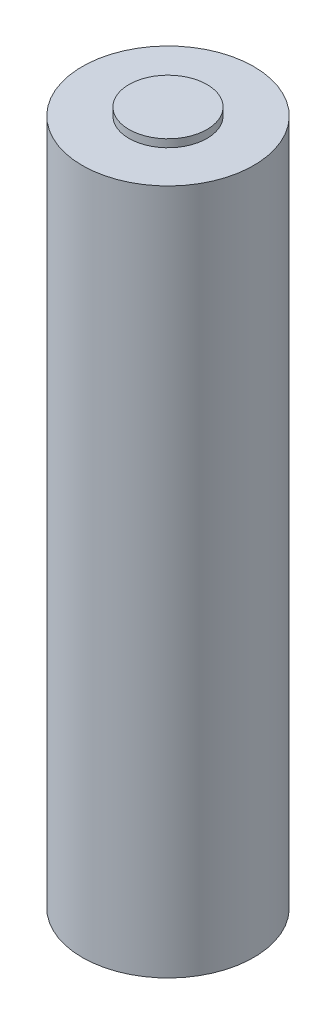
ISO-10303-21;
HEADER;
FILE_DESCRIPTION(('STEP AP214'),'2;1');
FILE_NAME('part.step','',(''),(''),'','','');
FILE_SCHEMA(('AUTOMOTIVE_DESIGN { 1 0 10303 214 1 1 1 1 }'));
ENDSEC;
DATA;
#1=APPLICATION_CONTEXT('core data for automotive mechanical design processes');
#2=APPLICATION_PROTOCOL_DEFINITION('international standard','automotive_design',2000,#1);
#3=PRODUCT_CONTEXT('',#1,'mechanical');
#4=PRODUCT('Part','Part','',(#3));
#5=PRODUCT_RELATED_PRODUCT_CATEGORY('part','',(#4));
#6=PRODUCT_DEFINITION_FORMATION('','',#4);
#7=PRODUCT_DEFINITION_CONTEXT('part definition',#1,'design');
#8=PRODUCT_DEFINITION('design','',#6,#7);
#9=PRODUCT_DEFINITION_SHAPE('','',#8);
#10=(LENGTH_UNIT() NAMED_UNIT(*) SI_UNIT(.MILLI.,.METRE.));
#11=(NAMED_UNIT(*) PLANE_ANGLE_UNIT() SI_UNIT($,.RADIAN.));
#12=(NAMED_UNIT(*) SI_UNIT($,.STERADIAN.) SOLID_ANGLE_UNIT());
#13=UNCERTAINTY_MEASURE_WITH_UNIT(LENGTH_MEASURE(1.E-05),#10,'distance_accuracy_value','');
#14=(GEOMETRIC_REPRESENTATION_CONTEXT(3) GLOBAL_UNCERTAINTY_ASSIGNED_CONTEXT((#13)) GLOBAL_UNIT_ASSIGNED_CONTEXT((#10,
#11,#12)) REPRESENTATION_CONTEXT('',''));
#15=CARTESIAN_POINT('',(0.,0.,0.));
#16=DIRECTION('',(0.,0.,1.));
#17=DIRECTION('',(1.,0.,0.));
#18=AXIS2_PLACEMENT_3D('',#15,#16,#17);
#19=CARTESIAN_POINT('',(0.,44.,0.));
#20=DIRECTION('',(0.,1.,0.));
#21=DIRECTION('',(0.,0.,1.));
#22=AXIS2_PLACEMENT_3D('',#19,#20,#21);
#23=PLANE('',#22);
#24=CARTESIAN_POINT('',(0.,44.,0.));
#25=DIRECTION('',(0.,1.,0.));
#26=DIRECTION('',(0.,0.,1.));
#27=AXIS2_PLACEMENT_3D('',#24,#25,#26);
#28=CIRCLE('',#27,5.5);
#29=CARTESIAN_POINT('',(0.,44.,5.5));
#30=VERTEX_POINT('',#29);
#31=EDGE_CURVE('E10',#30,#30,#28,.T.);
#32=ORIENTED_EDGE('',*,*,#31,.T.);
#33=EDGE_LOOP('',(#32));
#34=FACE_BOUND('',#33,.T.);
#35=CARTESIAN_POINT('',(0.,44.,0.));
#36=DIRECTION('',(0.,1.,0.));
#37=DIRECTION('',(0.,0.,1.));
#38=AXIS2_PLACEMENT_3D('',#35,#36,#37);
#39=CIRCLE('',#38,2.5);
#40=CARTESIAN_POINT('',(0.,44.,2.5));
#41=VERTEX_POINT('',#40);
#42=EDGE_CURVE('E380',#41,#41,#39,.T.);
#43=ORIENTED_EDGE('',*,*,#42,.F.);
#44=EDGE_LOOP('',(#43));
#45=FACE_BOUND('',#44,.T.);
#46=ADVANCED_FACE('F365',(#34,#45),#23,.T.);
#47=CARTESIAN_POINT('',(0.,44.,0.));
#48=DIRECTION('',(0.,-1.,0.));
#49=DIRECTION('',(0.,0.,-1.));
#50=AXIS2_PLACEMENT_3D('',#47,#48,#49);
#51=CYLINDRICAL_SURFACE('',#50,5.5);
#52=ORIENTED_EDGE('',*,*,#31,.F.);
#53=EDGE_LOOP('',(#52));
#54=FACE_BOUND('',#53,.T.);
#55=CARTESIAN_POINT('',(0.,0.,0.));
#56=DIRECTION('',(0.,1.,0.));
#57=DIRECTION('',(0.,0.,1.));
#58=AXIS2_PLACEMENT_3D('',#55,#56,#57);
#59=CIRCLE('',#58,5.5);
#60=CARTESIAN_POINT('',(0.,0.,5.5));
#61=VERTEX_POINT('',#60);
#62=EDGE_CURVE('E372',#61,#61,#59,.T.);
#63=ORIENTED_EDGE('',*,*,#62,.T.);
#64=EDGE_LOOP('',(#63));
#65=FACE_BOUND('',#64,.T.);
#66=ADVANCED_FACE('F367',(#54,#65),#51,.T.);
#67=CARTESIAN_POINT('',(0.,0.,0.));
#68=DIRECTION('',(0.,1.,0.));
#69=DIRECTION('',(0.,0.,1.));
#70=AXIS2_PLACEMENT_3D('',#67,#68,#69);
#71=PLANE('',#70);
#72=ORIENTED_EDGE('',*,*,#62,.F.);
#73=EDGE_LOOP('',(#72));
#74=FACE_BOUND('',#73,.T.);
#75=ADVANCED_FACE('F394',(#74),#71,.F.);
#76=CARTESIAN_POINT('',(0.,44.5,0.));
#77=DIRECTION('',(0.,-1.,0.));
#78=DIRECTION('',(0.,0.,-1.));
#79=AXIS2_PLACEMENT_3D('',#76,#77,#78);
#80=CYLINDRICAL_SURFACE('',#79,2.5);
#81=CARTESIAN_POINT('',(0.,44.5,0.));
#82=DIRECTION('',(0.,1.,0.));
#83=DIRECTION('',(0.,0.,1.));
#84=AXIS2_PLACEMENT_3D('',#81,#82,#83);
#85=CIRCLE('',#84,2.5);
#86=CARTESIAN_POINT('',(0.,44.5,2.5));
#87=VERTEX_POINT('',#86);
#88=EDGE_CURVE('E376',#87,#87,#85,.T.);
#89=ORIENTED_EDGE('',*,*,#88,.F.);
#90=EDGE_LOOP('',(#89));
#91=FACE_BOUND('',#90,.T.);
#92=ORIENTED_EDGE('',*,*,#42,.T.);
#93=EDGE_LOOP('',(#92));
#94=FACE_BOUND('',#93,.T.);
#95=ADVANCED_FACE('F386',(#91,#94),#80,.T.);
#96=CARTESIAN_POINT('',(0.,44.5,0.));
#97=DIRECTION('',(0.,1.,0.));
#98=DIRECTION('',(0.,0.,1.));
#99=AXIS2_PLACEMENT_3D('',#96,#97,#98);
#100=PLANE('',#99);
#101=ORIENTED_EDGE('',*,*,#88,.T.);
#102=EDGE_LOOP('',(#101));
#103=FACE_BOUND('',#102,.T.);
#104=ADVANCED_FACE('F400',(#103),#100,.T.);
#105=CLOSED_SHELL('',(#46,#66,#75,#95,#104));
#106=MANIFOLD_SOLID_BREP('B2',#105);
#107=ADVANCED_BREP_SHAPE_REPRESENTATION('',(#18,#106),#14);
#108=SHAPE_DEFINITION_REPRESENTATION(#9,#107);
ENDSEC;
END-ISO-10303-21;
